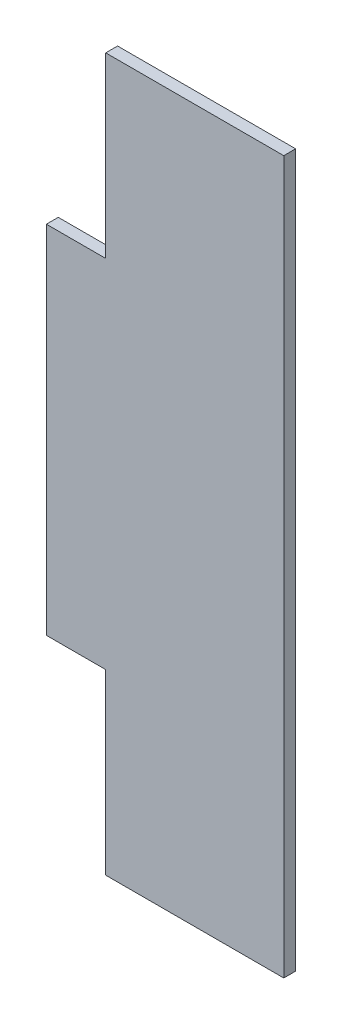
ISO-10303-21;
HEADER;
FILE_DESCRIPTION(('STEP AP214'),'2;1');
FILE_NAME('part.step','',(''),(''),'','','');
FILE_SCHEMA(('AUTOMOTIVE_DESIGN { 1 0 10303 214 1 1 1 1 }'));
ENDSEC;
DATA;
#1=APPLICATION_CONTEXT('core data for automotive mechanical design processes');
#2=APPLICATION_PROTOCOL_DEFINITION('international standard','automotive_design',2000,#1);
#3=PRODUCT_CONTEXT('',#1,'mechanical');
#4=PRODUCT('Part','Part','',(#3));
#5=PRODUCT_RELATED_PRODUCT_CATEGORY('part','',(#4));
#6=PRODUCT_DEFINITION_FORMATION('','',#4);
#7=PRODUCT_DEFINITION_CONTEXT('part definition',#1,'design');
#8=PRODUCT_DEFINITION('design','',#6,#7);
#9=PRODUCT_DEFINITION_SHAPE('','',#8);
#10=(LENGTH_UNIT() NAMED_UNIT(*) SI_UNIT(.MILLI.,.METRE.));
#11=(NAMED_UNIT(*) PLANE_ANGLE_UNIT() SI_UNIT($,.RADIAN.));
#12=(NAMED_UNIT(*) SI_UNIT($,.STERADIAN.) SOLID_ANGLE_UNIT());
#13=UNCERTAINTY_MEASURE_WITH_UNIT(LENGTH_MEASURE(1.E-05),#10,'distance_accuracy_value','');
#14=(GEOMETRIC_REPRESENTATION_CONTEXT(3) GLOBAL_UNCERTAINTY_ASSIGNED_CONTEXT((#13)) GLOBAL_UNIT_ASSIGNED_CONTEXT((#10,
#11,#12)) REPRESENTATION_CONTEXT('',''));
#15=CARTESIAN_POINT('',(0.,0.,0.));
#16=DIRECTION('',(0.,0.,1.));
#17=DIRECTION('',(1.,0.,0.));
#18=AXIS2_PLACEMENT_3D('',#15,#16,#17);
#19=CARTESIAN_POINT('',(-0.05,0.3,-0.01));
#20=DIRECTION('',(0.,0.,1.));
#21=DIRECTION('',(0.,-1.,0.));
#22=AXIS2_PLACEMENT_3D('',#19,#20,#21);
#23=PLANE('',#22);
#24=DIRECTION('',(1.,0.,0.));
#25=VECTOR('',#24,1.);
#26=CARTESIAN_POINT('',(0.1,-0.3,-0.01));
#27=LINE('',#26,#25);
#28=CARTESIAN_POINT('',(0.1,-0.3,-0.01));
#29=VERTEX_POINT('',#28);
#30=CARTESIAN_POINT('',(-0.05,-0.3,-0.01));
#31=VERTEX_POINT('',#30);
#32=EDGE_CURVE('E121',#29,#31,#27,.F.);
#33=ORIENTED_EDGE('',*,*,#32,.T.);
#34=DIRECTION('',(0.,1.,0.));
#35=VECTOR('',#34,1.);
#36=CARTESIAN_POINT('',(-0.05,-0.3,-0.01));
#37=LINE('',#36,#35);
#38=CARTESIAN_POINT('',(-0.05,-0.15,-0.01));
#39=VERTEX_POINT('',#38);
#40=EDGE_CURVE('E116',#31,#39,#37,.T.);
#41=ORIENTED_EDGE('',*,*,#40,.T.);
#42=DIRECTION('',(1.,0.,0.));
#43=VECTOR('',#42,1.);
#44=CARTESIAN_POINT('',(-0.05,-0.15,-0.01));
#45=LINE('',#44,#43);
#46=CARTESIAN_POINT('',(-0.1,-0.15,-0.01));
#47=VERTEX_POINT('',#46);
#48=EDGE_CURVE('E112',#39,#47,#45,.F.);
#49=ORIENTED_EDGE('',*,*,#48,.T.);
#50=DIRECTION('',(0.,1.,0.));
#51=VECTOR('',#50,1.);
#52=CARTESIAN_POINT('',(-0.1,-0.15,-0.01));
#53=LINE('',#52,#51);
#54=CARTESIAN_POINT('',(-0.1,0.15,-0.01));
#55=VERTEX_POINT('',#54);
#56=EDGE_CURVE('E108',#47,#55,#53,.T.);
#57=ORIENTED_EDGE('',*,*,#56,.T.);
#58=DIRECTION('',(1.,0.,0.));
#59=VECTOR('',#58,1.);
#60=CARTESIAN_POINT('',(-0.1,0.15,-0.01));
#61=LINE('',#60,#59);
#62=CARTESIAN_POINT('',(-0.05,0.15,-0.01));
#63=VERTEX_POINT('',#62);
#64=EDGE_CURVE('E104',#55,#63,#61,.T.);
#65=ORIENTED_EDGE('',*,*,#64,.T.);
#66=DIRECTION('',(0.,1.,0.));
#67=VECTOR('',#66,1.);
#68=CARTESIAN_POINT('',(-0.05,0.15,-0.01));
#69=LINE('',#68,#67);
#70=CARTESIAN_POINT('',(-0.05,0.3,-0.01));
#71=VERTEX_POINT('',#70);
#72=EDGE_CURVE('E80',#63,#71,#69,.T.);
#73=ORIENTED_EDGE('',*,*,#72,.T.);
#74=DIRECTION('',(1.,0.,0.));
#75=VECTOR('',#74,1.);
#76=CARTESIAN_POINT('',(-0.05,0.3,-0.01));
#77=LINE('',#76,#75);
#78=CARTESIAN_POINT('',(0.1,0.3,-0.01));
#79=VERTEX_POINT('',#78);
#80=EDGE_CURVE('E82',#71,#79,#77,.T.);
#81=ORIENTED_EDGE('',*,*,#80,.T.);
#82=DIRECTION('',(0.,1.,0.));
#83=VECTOR('',#82,1.);
#84=CARTESIAN_POINT('',(0.1,0.3,-0.01));
#85=LINE('',#84,#83);
#86=EDGE_CURVE('E20',#79,#29,#85,.F.);
#87=ORIENTED_EDGE('',*,*,#86,.T.);
#88=EDGE_LOOP('',(#33,#41,#49,#57,#65,#73,#81,#87));
#89=FACE_BOUND('',#88,.T.);
#90=ADVANCED_FACE('F17',(#89),#23,.F.);
#91=CARTESIAN_POINT('',(0.1,0.3,0.));
#92=DIRECTION('',(-1.,0.,0.));
#93=DIRECTION('',(0.,0.,1.));
#94=AXIS2_PLACEMENT_3D('',#91,#92,#93);
#95=PLANE('',#94);
#96=ORIENTED_EDGE('',*,*,#86,.F.);
#97=DIRECTION('',(0.,0.,-1.));
#98=VECTOR('',#97,1.);
#99=CARTESIAN_POINT('',(0.1,0.3,0.));
#100=LINE('',#99,#98);
#101=CARTESIAN_POINT('',(0.1,0.3,0.));
#102=VERTEX_POINT('',#101);
#103=EDGE_CURVE('E88',#79,#102,#100,.F.);
#104=ORIENTED_EDGE('',*,*,#103,.T.);
#105=DIRECTION('',(0.,-1.,0.));
#106=VECTOR('',#105,1.);
#107=CARTESIAN_POINT('',(0.1,0.3,0.));
#108=LINE('',#107,#106);
#109=CARTESIAN_POINT('',(0.1,-0.3,0.));
#110=VERTEX_POINT('',#109);
#111=EDGE_CURVE('E124',#110,#102,#108,.F.);
#112=ORIENTED_EDGE('',*,*,#111,.F.);
#113=DIRECTION('',(0.,0.,1.));
#114=VECTOR('',#113,1.);
#115=CARTESIAN_POINT('',(0.1,-0.3,0.));
#116=LINE('',#115,#114);
#117=EDGE_CURVE('E93',#110,#29,#116,.F.);
#118=ORIENTED_EDGE('',*,*,#117,.T.);
#119=EDGE_LOOP('',(#96,#104,#112,#118));
#120=FACE_BOUND('',#119,.T.);
#121=ADVANCED_FACE('F90',(#120),#95,.F.);
#122=CARTESIAN_POINT('',(-0.05,0.3,0.));
#123=DIRECTION('',(0.,-1.,0.));
#124=DIRECTION('',(0.,0.,-1.));
#125=AXIS2_PLACEMENT_3D('',#122,#123,#124);
#126=PLANE('',#125);
#127=ORIENTED_EDGE('',*,*,#80,.F.);
#128=DIRECTION('',(0.,0.,-1.));
#129=VECTOR('',#128,1.);
#130=CARTESIAN_POINT('',(-0.05,0.3,0.));
#131=LINE('',#130,#129);
#132=CARTESIAN_POINT('',(-0.05,0.3,0.));
#133=VERTEX_POINT('',#132);
#134=EDGE_CURVE('E100',#71,#133,#131,.F.);
#135=ORIENTED_EDGE('',*,*,#134,.T.);
#136=DIRECTION('',(1.,0.,0.));
#137=VECTOR('',#136,1.);
#138=CARTESIAN_POINT('',(-0.05,0.3,0.));
#139=LINE('',#138,#137);
#140=EDGE_CURVE('E97',#102,#133,#139,.F.);
#141=ORIENTED_EDGE('',*,*,#140,.F.);
#142=ORIENTED_EDGE('',*,*,#103,.F.);
#143=EDGE_LOOP('',(#127,#135,#141,#142));
#144=FACE_BOUND('',#143,.T.);
#145=ADVANCED_FACE('F95',(#144),#126,.F.);
#146=CARTESIAN_POINT('',(-0.05,0.15,0.));
#147=DIRECTION('',(1.,0.,0.));
#148=DIRECTION('',(0.,0.,-1.));
#149=AXIS2_PLACEMENT_3D('',#146,#147,#148);
#150=PLANE('',#149);
#151=ORIENTED_EDGE('',*,*,#72,.F.);
#152=DIRECTION('',(0.,0.,-1.));
#153=VECTOR('',#152,1.);
#154=CARTESIAN_POINT('',(-0.05,0.15,0.));
#155=LINE('',#154,#153);
#156=CARTESIAN_POINT('',(-0.05,0.15,0.));
#157=VERTEX_POINT('',#156);
#158=EDGE_CURVE('E106',#63,#157,#155,.F.);
#159=ORIENTED_EDGE('',*,*,#158,.T.);
#160=DIRECTION('',(0.,-1.,0.));
#161=VECTOR('',#160,1.);
#162=CARTESIAN_POINT('',(-0.05,0.3,0.));
#163=LINE('',#162,#161);
#164=EDGE_CURVE('E127',#133,#157,#163,.T.);
#165=ORIENTED_EDGE('',*,*,#164,.F.);
#166=ORIENTED_EDGE('',*,*,#134,.F.);
#167=EDGE_LOOP('',(#151,#159,#165,#166));
#168=FACE_BOUND('',#167,.T.);
#169=ADVANCED_FACE('F160',(#168),#150,.F.);
#170=CARTESIAN_POINT('',(-0.1,0.15,0.));
#171=DIRECTION('',(0.,-1.,0.));
#172=DIRECTION('',(0.,0.,-1.));
#173=AXIS2_PLACEMENT_3D('',#170,#171,#172);
#174=PLANE('',#173);
#175=ORIENTED_EDGE('',*,*,#64,.F.);
#176=DIRECTION('',(0.,0.,-1.));
#177=VECTOR('',#176,1.);
#178=CARTESIAN_POINT('',(-0.1,0.15,0.));
#179=LINE('',#178,#177);
#180=CARTESIAN_POINT('',(-0.1,0.15,0.));
#181=VERTEX_POINT('',#180);
#182=EDGE_CURVE('E110',#55,#181,#179,.F.);
#183=ORIENTED_EDGE('',*,*,#182,.T.);
#184=DIRECTION('',(1.,0.,0.));
#185=VECTOR('',#184,1.);
#186=CARTESIAN_POINT('',(-0.05,0.15,0.));
#187=LINE('',#186,#185);
#188=EDGE_CURVE('E130',#157,#181,#187,.F.);
#189=ORIENTED_EDGE('',*,*,#188,.F.);
#190=ORIENTED_EDGE('',*,*,#158,.F.);
#191=EDGE_LOOP('',(#175,#183,#189,#190));
#192=FACE_BOUND('',#191,.T.);
#193=ADVANCED_FACE('F157',(#192),#174,.F.);
#194=CARTESIAN_POINT('',(-0.1,-0.15,0.));
#195=DIRECTION('',(1.,0.,0.));
#196=DIRECTION('',(0.,0.,-1.));
#197=AXIS2_PLACEMENT_3D('',#194,#195,#196);
#198=PLANE('',#197);
#199=ORIENTED_EDGE('',*,*,#56,.F.);
#200=DIRECTION('',(0.,0.,1.));
#201=VECTOR('',#200,1.);
#202=CARTESIAN_POINT('',(-0.1,-0.15,0.));
#203=LINE('',#202,#201);
#204=CARTESIAN_POINT('',(-0.1,-0.15,0.));
#205=VERTEX_POINT('',#204);
#206=EDGE_CURVE('E114',#47,#205,#203,.T.);
#207=ORIENTED_EDGE('',*,*,#206,.T.);
#208=DIRECTION('',(0.,-1.,0.));
#209=VECTOR('',#208,1.);
#210=CARTESIAN_POINT('',(-0.1,0.3,0.));
#211=LINE('',#210,#209);
#212=EDGE_CURVE('E133',#181,#205,#211,.T.);
#213=ORIENTED_EDGE('',*,*,#212,.F.);
#214=ORIENTED_EDGE('',*,*,#182,.F.);
#215=EDGE_LOOP('',(#199,#207,#213,#214));
#216=FACE_BOUND('',#215,.T.);
#217=ADVANCED_FACE('F153',(#216),#198,.F.);
#218=CARTESIAN_POINT('',(-0.05,-0.15,0.));
#219=DIRECTION('',(0.,1.,0.));
#220=DIRECTION('',(0.,0.,1.));
#221=AXIS2_PLACEMENT_3D('',#218,#219,#220);
#222=PLANE('',#221);
#223=ORIENTED_EDGE('',*,*,#48,.F.);
#224=DIRECTION('',(0.,0.,-1.));
#225=VECTOR('',#224,1.);
#226=CARTESIAN_POINT('',(-0.05,-0.15,0.));
#227=LINE('',#226,#225);
#228=CARTESIAN_POINT('',(-0.05,-0.15,0.));
#229=VERTEX_POINT('',#228);
#230=EDGE_CURVE('E118',#39,#229,#227,.F.);
#231=ORIENTED_EDGE('',*,*,#230,.T.);
#232=DIRECTION('',(1.,0.,0.));
#233=VECTOR('',#232,1.);
#234=CARTESIAN_POINT('',(-0.05,-0.15,0.));
#235=LINE('',#234,#233);
#236=EDGE_CURVE('E136',#205,#229,#235,.T.);
#237=ORIENTED_EDGE('',*,*,#236,.F.);
#238=ORIENTED_EDGE('',*,*,#206,.F.);
#239=EDGE_LOOP('',(#223,#231,#237,#238));
#240=FACE_BOUND('',#239,.T.);
#241=ADVANCED_FACE('F147',(#240),#222,.F.);
#242=CARTESIAN_POINT('',(-0.05,-0.3,0.));
#243=DIRECTION('',(1.,0.,0.));
#244=DIRECTION('',(0.,0.,-1.));
#245=AXIS2_PLACEMENT_3D('',#242,#243,#244);
#246=PLANE('',#245);
#247=ORIENTED_EDGE('',*,*,#40,.F.);
#248=DIRECTION('',(0.,0.,1.));
#249=VECTOR('',#248,1.);
#250=CARTESIAN_POINT('',(-0.05,-0.3,0.));
#251=LINE('',#250,#249);
#252=CARTESIAN_POINT('',(-0.05,-0.3,0.));
#253=VERTEX_POINT('',#252);
#254=EDGE_CURVE('E35',#31,#253,#251,.T.);
#255=ORIENTED_EDGE('',*,*,#254,.T.);
#256=DIRECTION('',(0.,-1.,0.));
#257=VECTOR('',#256,1.);
#258=CARTESIAN_POINT('',(-0.05,0.3,0.));
#259=LINE('',#258,#257);
#260=EDGE_CURVE('E26',#229,#253,#259,.T.);
#261=ORIENTED_EDGE('',*,*,#260,.F.);
#262=ORIENTED_EDGE('',*,*,#230,.F.);
#263=EDGE_LOOP('',(#247,#255,#261,#262));
#264=FACE_BOUND('',#263,.T.);
#265=ADVANCED_FACE('F144',(#264),#246,.F.);
#266=CARTESIAN_POINT('',(0.1,-0.3,0.));
#267=DIRECTION('',(0.,1.,0.));
#268=DIRECTION('',(0.,0.,1.));
#269=AXIS2_PLACEMENT_3D('',#266,#267,#268);
#270=PLANE('',#269);
#271=ORIENTED_EDGE('',*,*,#32,.F.);
#272=ORIENTED_EDGE('',*,*,#117,.F.);
#273=DIRECTION('',(1.,0.,0.));
#274=VECTOR('',#273,1.);
#275=CARTESIAN_POINT('',(-0.05,-0.3,0.));
#276=LINE('',#275,#274);
#277=EDGE_CURVE('E11',#253,#110,#276,.T.);
#278=ORIENTED_EDGE('',*,*,#277,.F.);
#279=ORIENTED_EDGE('',*,*,#254,.F.);
#280=EDGE_LOOP('',(#271,#272,#278,#279));
#281=FACE_BOUND('',#280,.T.);
#282=ADVANCED_FACE('F163',(#281),#270,.F.);
#283=CARTESIAN_POINT('',(-0.05,0.3,0.));
#284=DIRECTION('',(0.,0.,1.));
#285=DIRECTION('',(0.,-1.,0.));
#286=AXIS2_PLACEMENT_3D('',#283,#284,#285);
#287=PLANE('',#286);
#288=ORIENTED_EDGE('',*,*,#260,.T.);
#289=ORIENTED_EDGE('',*,*,#277,.T.);
#290=ORIENTED_EDGE('',*,*,#111,.T.);
#291=ORIENTED_EDGE('',*,*,#140,.T.);
#292=ORIENTED_EDGE('',*,*,#164,.T.);
#293=ORIENTED_EDGE('',*,*,#188,.T.);
#294=ORIENTED_EDGE('',*,*,#212,.T.);
#295=ORIENTED_EDGE('',*,*,#236,.T.);
#296=EDGE_LOOP('',(#288,#289,#290,#291,#292,#293,#294,#295));
#297=FACE_BOUND('',#296,.T.);
#298=ADVANCED_FACE('F141',(#297),#287,.T.);
#299=CLOSED_SHELL('',(#90,#121,#145,#169,#193,#217,#241,#265,#282,#298));
#300=MANIFOLD_SOLID_BREP('B1',#299);
#301=ADVANCED_BREP_SHAPE_REPRESENTATION('',(#18,#300),#14);
#302=SHAPE_DEFINITION_REPRESENTATION(#9,#301);
ENDSEC;
END-ISO-10303-21;
